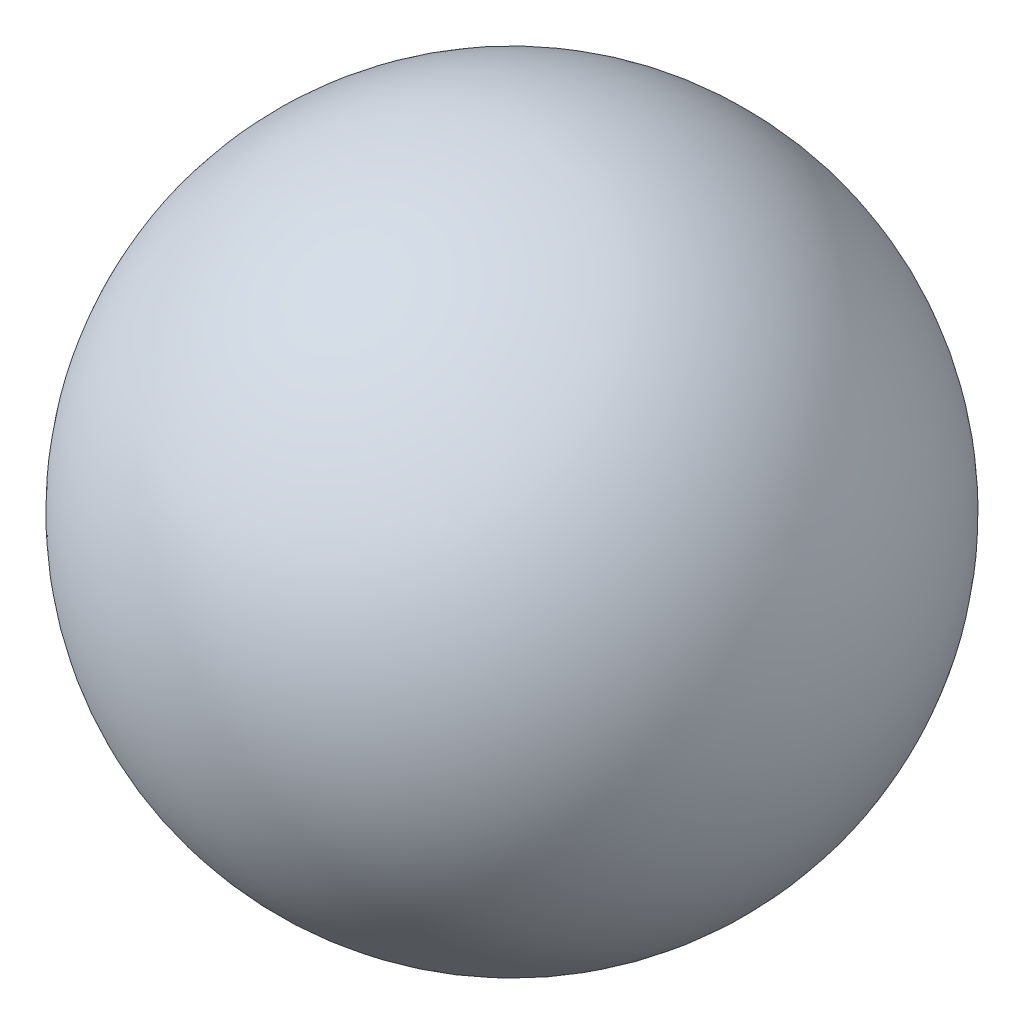
ISO-10303-21;
HEADER;
FILE_DESCRIPTION(('STEP AP214'),'2;1');
FILE_NAME('part.step','',(''),(''),'','','');
FILE_SCHEMA(('AUTOMOTIVE_DESIGN { 1 0 10303 214 1 1 1 1 }'));
ENDSEC;
DATA;
#1=APPLICATION_CONTEXT('core data for automotive mechanical design processes');
#2=APPLICATION_PROTOCOL_DEFINITION('international standard','automotive_design',2000,#1);
#3=PRODUCT_CONTEXT('',#1,'mechanical');
#4=PRODUCT('Part','Part','',(#3));
#5=PRODUCT_RELATED_PRODUCT_CATEGORY('part','',(#4));
#6=PRODUCT_DEFINITION_FORMATION('','',#4);
#7=PRODUCT_DEFINITION_CONTEXT('part definition',#1,'design');
#8=PRODUCT_DEFINITION('design','',#6,#7);
#9=PRODUCT_DEFINITION_SHAPE('','',#8);
#10=(LENGTH_UNIT() NAMED_UNIT(*) SI_UNIT(.MILLI.,.METRE.));
#11=(NAMED_UNIT(*) PLANE_ANGLE_UNIT() SI_UNIT($,.RADIAN.));
#12=(NAMED_UNIT(*) SI_UNIT($,.STERADIAN.) SOLID_ANGLE_UNIT());
#13=UNCERTAINTY_MEASURE_WITH_UNIT(LENGTH_MEASURE(1.E-05),#10,'distance_accuracy_value','');
#14=(GEOMETRIC_REPRESENTATION_CONTEXT(3) GLOBAL_UNCERTAINTY_ASSIGNED_CONTEXT((#13)) GLOBAL_UNIT_ASSIGNED_CONTEXT((#10,
#11,#12)) REPRESENTATION_CONTEXT('',''));
#15=CARTESIAN_POINT('',(0.,0.,0.));
#16=DIRECTION('',(0.,0.,1.));
#17=DIRECTION('',(1.,0.,0.));
#18=AXIS2_PLACEMENT_3D('',#15,#16,#17);
#19=CARTESIAN_POINT('',(2.5,9.75,0.));
#20=DIRECTION('',(-1.,0.,0.));
#21=DIRECTION('',(0.,1.,0.));
#22=AXIS2_PLACEMENT_3D('',#19,#20,#21);
#23=SPHERICAL_SURFACE('',#22,1.1905);
#24=CARTESIAN_POINT('',(1.3095,9.75,0.));
#25=VERTEX_POINT('',#24);
#26=VERTEX_LOOP('',#25);
#27=FACE_BOUND('',#26,.T.);
#28=ADVANCED_FACE('F33',(#27),#23,.T.);
#29=CLOSED_SHELL('',(#28));
#30=MANIFOLD_SOLID_BREP('B2',#29);
#31=ADVANCED_BREP_SHAPE_REPRESENTATION('',(#18,#30),#14);
#32=SHAPE_DEFINITION_REPRESENTATION(#9,#31);
ENDSEC;
END-ISO-10303-21;
